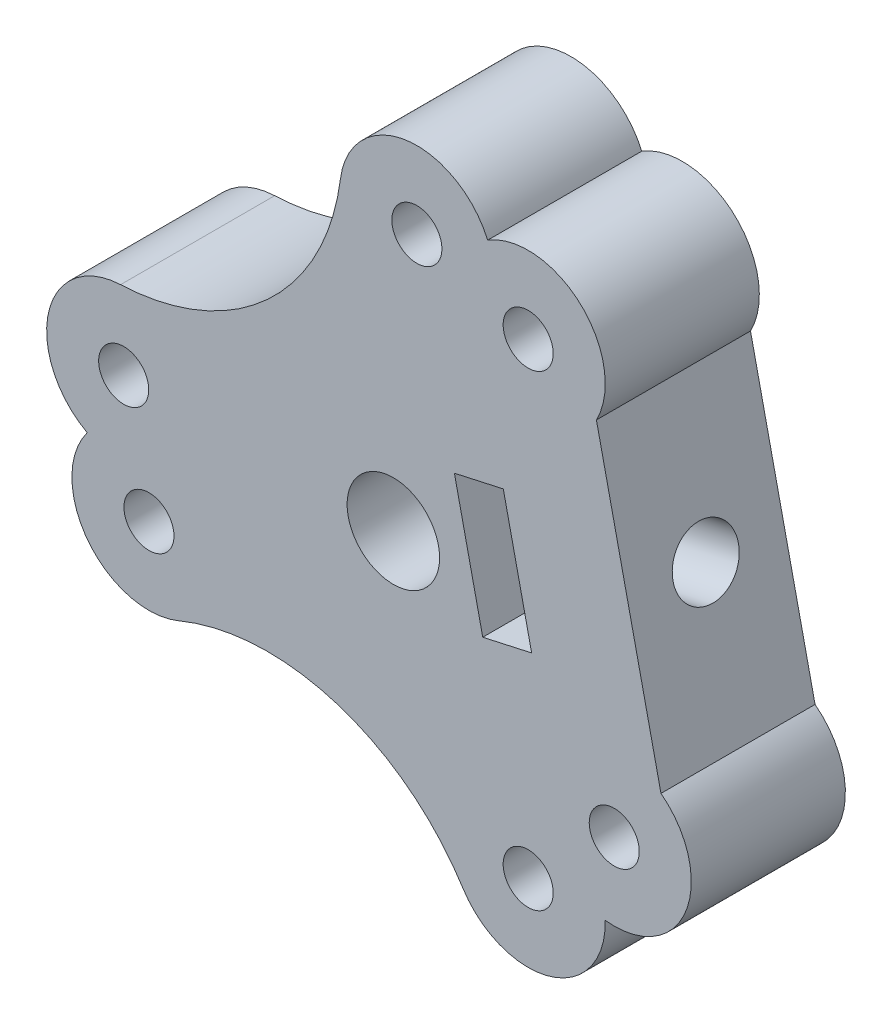
ISO-10303-21;
HEADER;
FILE_DESCRIPTION(('STEP AP214'),'2;1');
FILE_NAME('part.step','',(''),(''),'','','');
FILE_SCHEMA(('AUTOMOTIVE_DESIGN { 1 0 10303 214 1 1 1 1 }'));
ENDSEC;
DATA;
#1=APPLICATION_CONTEXT('core data for automotive mechanical design processes');
#2=APPLICATION_PROTOCOL_DEFINITION('international standard','automotive_design',2000,#1);
#3=PRODUCT_CONTEXT('',#1,'mechanical');
#4=PRODUCT('Part','Part','',(#3));
#5=PRODUCT_RELATED_PRODUCT_CATEGORY('part','',(#4));
#6=PRODUCT_DEFINITION_FORMATION('','',#4);
#7=PRODUCT_DEFINITION_CONTEXT('part definition',#1,'design');
#8=PRODUCT_DEFINITION('design','',#6,#7);
#9=PRODUCT_DEFINITION_SHAPE('','',#8);
#10=(LENGTH_UNIT() NAMED_UNIT(*) SI_UNIT(.MILLI.,.METRE.));
#11=(NAMED_UNIT(*) PLANE_ANGLE_UNIT() SI_UNIT($,.RADIAN.));
#12=(NAMED_UNIT(*) SI_UNIT($,.STERADIAN.) SOLID_ANGLE_UNIT());
#13=UNCERTAINTY_MEASURE_WITH_UNIT(LENGTH_MEASURE(1.E-05),#10,'distance_accuracy_value','');
#14=(GEOMETRIC_REPRESENTATION_CONTEXT(3) GLOBAL_UNCERTAINTY_ASSIGNED_CONTEXT((#13)) GLOBAL_UNIT_ASSIGNED_CONTEXT((#10,
#11,#12)) REPRESENTATION_CONTEXT('',''));
#15=CARTESIAN_POINT('',(0.,0.,0.));
#16=DIRECTION('',(0.,0.,1.));
#17=DIRECTION('',(1.,0.,0.));
#18=AXIS2_PLACEMENT_3D('',#15,#16,#17);
#19=CARTESIAN_POINT('',(8.88999999999986,15.3979316792874,10.16));
#20=DIRECTION('',(0.,0.,-1.));
#21=DIRECTION('',(-1.,0.,0.));
#22=AXIS2_PLACEMENT_3D('',#19,#20,#21);
#23=CYLINDRICAL_SURFACE('',#22,5.08);
#24=CARTESIAN_POINT('',(8.88999999999986,15.3979316792874,10.16));
#25=DIRECTION('',(0.,0.,1.));
#26=DIRECTION('',(-0.499999999999992,-0.866025403784443,0.));
#27=AXIS2_PLACEMENT_3D('',#24,#25,#26);
#28=CIRCLE('',#27,5.08);
#29=CARTESIAN_POINT('',(13.3888501957453,13.0385362236165,10.16));
#30=VERTEX_POINT('',#29);
#31=CARTESIAN_POINT('',(6.21700754789933,19.717828825171,10.16));
#32=VERTEX_POINT('',#31);
#33=EDGE_CURVE('E149',#30,#32,#28,.T.);
#34=ORIENTED_EDGE('',*,*,#33,.F.);
#35=DIRECTION('',(0.,0.,-1.));
#36=VECTOR('',#35,1.);
#37=CARTESIAN_POINT('',(13.3888501957454,13.0385362236164,10.16));
#38=LINE('',#37,#36);
#39=CARTESIAN_POINT('',(13.3888501957453,13.0385362236165,0.));
#40=VERTEX_POINT('',#39);
#41=EDGE_CURVE('E134',#30,#40,#38,.T.);
#42=ORIENTED_EDGE('',*,*,#41,.T.);
#43=CARTESIAN_POINT('',(8.88999999999986,15.3979316792874,0.));
#44=DIRECTION('',(0.,0.,1.));
#45=DIRECTION('',(-0.499999999999992,-0.866025403784443,0.));
#46=AXIS2_PLACEMENT_3D('',#43,#44,#45);
#47=CIRCLE('',#46,5.08);
#48=CARTESIAN_POINT('',(6.21700754789933,19.717828825171,0.));
#49=VERTEX_POINT('',#48);
#50=EDGE_CURVE('E147',#40,#49,#47,.T.);
#51=ORIENTED_EDGE('',*,*,#50,.T.);
#52=DIRECTION('',(0.,0.,-1.));
#53=VECTOR('',#52,1.);
#54=CARTESIAN_POINT('',(6.21700754789933,19.717828825171,5.08));
#55=LINE('',#54,#53);
#56=EDGE_CURVE('E228',#32,#49,#55,.T.);
#57=ORIENTED_EDGE('',*,*,#56,.F.);
#58=EDGE_LOOP('',(#34,#42,#51,#57));
#59=FACE_BOUND('',#58,.T.);
#60=ADVANCED_FACE('F37',(#59),#23,.T.);
#61=CARTESIAN_POINT('',(8.89000000000007,-15.3979316792873,10.16));
#62=DIRECTION('',(0.,0.,-1.));
#63=DIRECTION('',(-1.,0.,0.));
#64=AXIS2_PLACEMENT_3D('',#61,#62,#63);
#65=CYLINDRICAL_SURFACE('',#64,5.08);
#66=CARTESIAN_POINT('',(8.89000000000007,-15.3979316792873,10.16));
#67=DIRECTION('',(0.,0.,1.));
#68=DIRECTION('',(-0.500000000000004,0.866025403784436,0.));
#69=AXIS2_PLACEMENT_3D('',#66,#67,#68);
#70=CIRCLE('',#69,5.08);
#71=CARTESIAN_POINT('',(4.59727849994271,-18.114352508788,10.16));
#72=VERTEX_POINT('',#71);
#73=CARTESIAN_POINT('',(13.9676368961215,-15.243000884586,10.16));
#74=VERTEX_POINT('',#73);
#75=EDGE_CURVE('E172',#72,#74,#70,.T.);
#76=ORIENTED_EDGE('',*,*,#75,.F.);
#77=DIRECTION('',(0.,0.,-1.));
#78=VECTOR('',#77,1.);
#79=CARTESIAN_POINT('',(4.59727849994271,-18.114352508788,10.16));
#80=LINE('',#79,#78);
#81=CARTESIAN_POINT('',(4.59727849994271,-18.114352508788,0.));
#82=VERTEX_POINT('',#81);
#83=EDGE_CURVE('E210',#72,#82,#80,.T.);
#84=ORIENTED_EDGE('',*,*,#83,.T.);
#85=CARTESIAN_POINT('',(8.89000000000007,-15.3979316792873,0.));
#86=DIRECTION('',(0.,0.,1.));
#87=DIRECTION('',(-0.500000000000004,0.866025403784436,0.));
#88=AXIS2_PLACEMENT_3D('',#85,#86,#87);
#89=CIRCLE('',#88,5.08);
#90=CARTESIAN_POINT('',(13.9676368961215,-15.243000884586,0.));
#91=VERTEX_POINT('',#90);
#92=EDGE_CURVE('E169',#82,#91,#89,.T.);
#93=ORIENTED_EDGE('',*,*,#92,.T.);
#94=DIRECTION('',(0.,0.,-1.));
#95=VECTOR('',#94,1.);
#96=CARTESIAN_POINT('',(13.9676368961215,-15.243000884586,5.08));
#97=LINE('',#96,#95);
#98=EDGE_CURVE('E258',#74,#91,#97,.T.);
#99=ORIENTED_EDGE('',*,*,#98,.F.);
#100=EDGE_LOOP('',(#76,#84,#93,#99));
#101=FACE_BOUND('',#100,.T.);
#102=ADVANCED_FACE('F249',(#101),#65,.T.);
#103=CARTESIAN_POINT('',(-17.78,0.,10.16));
#104=DIRECTION('',(0.,0.,-1.));
#105=DIRECTION('',(-1.,0.,0.));
#106=AXIS2_PLACEMENT_3D('',#103,#104,#105);
#107=CYLINDRICAL_SURFACE('',#106,5.08);
#108=CARTESIAN_POINT('',(-17.78,0.,10.16));
#109=DIRECTION('',(0.,0.,1.));
#110=DIRECTION('',(1.,0.,0.));
#111=AXIS2_PLACEMENT_3D('',#108,#109,#110);
#112=CIRCLE('',#111,5.08);
#113=CARTESIAN_POINT('',(-17.9861286956882,5.07581628517167,10.16));
#114=VERTEX_POINT('',#113);
#115=CARTESIAN_POINT('',(-20.1846444440209,-4.47482794058491,10.16));
#116=VERTEX_POINT('',#115);
#117=EDGE_CURVE('E199',#114,#116,#112,.T.);
#118=ORIENTED_EDGE('',*,*,#117,.F.);
#119=DIRECTION('',(0.,0.,-1.));
#120=VECTOR('',#119,1.);
#121=CARTESIAN_POINT('',(-17.9861286956882,5.07581628517167,10.16));
#122=LINE('',#121,#120);
#123=CARTESIAN_POINT('',(-17.9861286956882,5.07581628517167,0.));
#124=VERTEX_POINT('',#123);
#125=EDGE_CURVE('E208',#114,#124,#122,.T.);
#126=ORIENTED_EDGE('',*,*,#125,.T.);
#127=CARTESIAN_POINT('',(-17.78,0.,0.));
#128=DIRECTION('',(0.,0.,1.));
#129=DIRECTION('',(1.,0.,0.));
#130=AXIS2_PLACEMENT_3D('',#127,#128,#129);
#131=CIRCLE('',#130,5.08);
#132=CARTESIAN_POINT('',(-20.1846444440209,-4.47482794058491,0.));
#133=VERTEX_POINT('',#132);
#134=EDGE_CURVE('E196',#124,#133,#131,.T.);
#135=ORIENTED_EDGE('',*,*,#134,.T.);
#136=DIRECTION('',(0.,0.,-1.));
#137=VECTOR('',#136,1.);
#138=CARTESIAN_POINT('',(-20.1846444440209,-4.47482794058491,5.08));
#139=LINE('',#138,#137);
#140=EDGE_CURVE('E201',#116,#133,#139,.T.);
#141=ORIENTED_EDGE('',*,*,#140,.F.);
#142=EDGE_LOOP('',(#118,#126,#135,#141));
#143=FACE_BOUND('',#142,.T.);
#144=ADVANCED_FACE('F240',(#143),#107,.T.);
#145=CARTESIAN_POINT('',(-17.78,0.,10.16));
#146=DIRECTION('',(0.,0.,1.));
#147=DIRECTION('',(1.,0.,0.));
#148=AXIS2_PLACEMENT_3D('',#145,#146,#147);
#149=PLANE('',#148);
#150=DIRECTION('',(0.21643961393811,-0.976296007119932,0.));
#151=VECTOR('',#150,1.);
#152=CARTESIAN_POINT('',(13.3888501957453,13.0385362236165,10.16));
#153=LINE('',#152,#151);
#154=CARTESIAN_POINT('',(17.6447427063392,-6.15855431459024,10.16));
#155=VERTEX_POINT('',#154);
#156=EDGE_CURVE('E141',#30,#155,#153,.T.);
#157=ORIENTED_EDGE('',*,*,#156,.F.);
#158=ORIENTED_EDGE('',*,*,#33,.T.);
#159=CARTESIAN_POINT('',(1.54962910605318,17.7123417320713,10.16));
#160=DIRECTION('',(0.,0.,1.));
#161=DIRECTION('',(-0.087155742747648,-0.996194698091746,0.));
#162=AXIS2_PLACEMENT_3D('',#159,#160,#161);
#163=CIRCLE('',#162,5.08);
#164=CARTESIAN_POINT('',(-3.48890686614827,18.3600725842251,10.16));
#165=VERTEX_POINT('',#164);
#166=EDGE_CURVE('E229',#32,#165,#163,.T.);
#167=ORIENTED_EDGE('',*,*,#166,.T.);
#168=CARTESIAN_POINT('',(-18.6045147827526,20.3032651406867,10.16));
#169=DIRECTION('',(0.,0.,1.));
#170=DIRECTION('',(1.,0.,0.));
#171=AXIS2_PLACEMENT_3D('',#168,#169,#170);
#172=CIRCLE('',#171,15.24);
#173=EDGE_CURVE('E215',#165,#114,#172,.F.);
#174=ORIENTED_EDGE('',*,*,#173,.T.);
#175=ORIENTED_EDGE('',*,*,#117,.T.);
#176=CARTESIAN_POINT('',(-16.1141524535116,-7.51415269374965,10.16));
#177=DIRECTION('',(0.,0.,1.));
#178=DIRECTION('',(0.90630778703665,0.4226182617407,0.));
#179=AXIS2_PLACEMENT_3D('',#176,#177,#178);
#180=CIRCLE('',#179,5.08);
#181=CARTESIAN_POINT('',(-14.1558358401911,-12.2015182696348,10.16));
#182=VERTEX_POINT('',#181);
#183=EDGE_CURVE('E182',#116,#182,#180,.T.);
#184=ORIENTED_EDGE('',*,*,#183,.T.);
#185=CARTESIAN_POINT('',(-8.28088600022939,-26.2636149972901,10.16));
#186=DIRECTION('',(0.,0.,1.));
#187=DIRECTION('',(1.,0.,0.));
#188=AXIS2_PLACEMENT_3D('',#185,#186,#187);
#189=CIRCLE('',#188,15.24);
#190=EDGE_CURVE('E11',#182,#72,#189,.F.);
#191=ORIENTED_EDGE('',*,*,#190,.T.);
#192=ORIENTED_EDGE('',*,*,#75,.T.);
#193=CARTESIAN_POINT('',(14.5645233474583,-10.1981890383215,10.16));
#194=DIRECTION('',(0.,0.,1.));
#195=DIRECTION('',(-0.819152044288995,0.573576436351042,0.));
#196=AXIS2_PLACEMENT_3D('',#193,#194,#195);
#197=CIRCLE('',#196,5.08);
#198=EDGE_CURVE('E254',#74,#155,#197,.T.);
#199=ORIENTED_EDGE('',*,*,#198,.T.);
#200=EDGE_LOOP('',(#157,#158,#167,#174,#175,#184,#191,#192,#199));
#201=FACE_BOUND('',#200,.T.);
#202=DIRECTION('',(-0.976296007119932,-0.216439613938109,0.));
#203=VECTOR('',#202,1.);
#204=CARTESIAN_POINT('',(7.24872687869451,6.0298430027731,10.16));
#205=LINE('',#204,#203);
#206=CARTESIAN_POINT('',(7.24872687869451,6.0298430027731,10.16));
#207=VERTEX_POINT('',#206);
#208=CARTESIAN_POINT('',(4.02499746318449,5.31515939754946,10.16));
#209=VERTEX_POINT('',#208);
#210=EDGE_CURVE('E53',#207,#209,#205,.T.);
#211=ORIENTED_EDGE('',*,*,#210,.F.);
#212=DIRECTION('',(-0.21643961393811,0.976296007119932,0.));
#213=VECTOR('',#212,1.);
#214=CARTESIAN_POINT('',(9.11789938466402,-2.40144931471462,10.16));
#215=LINE('',#214,#213);
#216=CARTESIAN_POINT('',(9.11789938466402,-2.40144931471462,10.16));
#217=VERTEX_POINT('',#216);
#218=EDGE_CURVE('E353',#217,#207,#215,.T.);
#219=ORIENTED_EDGE('',*,*,#218,.F.);
#220=DIRECTION('',(0.976296007119931,0.216439613938111,0.));
#221=VECTOR('',#220,1.);
#222=CARTESIAN_POINT('',(5.89416996915401,-3.11613291993827,10.16));
#223=LINE('',#222,#221);
#224=CARTESIAN_POINT('',(5.89416996915401,-3.11613291993827,10.16));
#225=VERTEX_POINT('',#224);
#226=EDGE_CURVE('E357',#225,#217,#223,.T.);
#227=ORIENTED_EDGE('',*,*,#226,.F.);
#228=DIRECTION('',(0.21643961393811,-0.976296007119932,0.));
#229=VECTOR('',#228,1.);
#230=CARTESIAN_POINT('',(4.02499746318449,5.31515939754946,10.16));
#231=LINE('',#230,#229);
#232=EDGE_CURVE('E360',#209,#225,#231,.T.);
#233=ORIENTED_EDGE('',*,*,#232,.F.);
#234=EDGE_LOOP('',(#211,#219,#227,#233));
#235=FACE_BOUND('',#234,.T.);
#236=CARTESIAN_POINT('',(0.,0.,10.16));
#237=DIRECTION('',(0.,0.,1.));
#238=DIRECTION('',(1.,0.,0.));
#239=AXIS2_PLACEMENT_3D('',#236,#237,#238);
#240=CIRCLE('',#239,3.048);
#241=CARTESIAN_POINT('',(3.048,0.,10.16));
#242=VERTEX_POINT('',#241);
#243=EDGE_CURVE('E193',#242,#242,#240,.T.);
#244=ORIENTED_EDGE('',*,*,#243,.F.);
#245=EDGE_LOOP('',(#244));
#246=FACE_BOUND('',#245,.T.);
#247=CARTESIAN_POINT('',(8.88999999999986,15.3979316792874,10.16));
#248=DIRECTION('',(0.,0.,1.));
#249=DIRECTION('',(-0.499999999999992,-0.866025403784443,0.));
#250=AXIS2_PLACEMENT_3D('',#247,#248,#249);
#251=CIRCLE('',#250,1.651);
#252=CARTESIAN_POINT('',(8.06449999999987,13.9681237376393,10.16));
#253=VERTEX_POINT('',#252);
#254=EDGE_CURVE('E157',#253,#253,#251,.T.);
#255=ORIENTED_EDGE('',*,*,#254,.F.);
#256=EDGE_LOOP('',(#255));
#257=FACE_BOUND('',#256,.T.);
#258=CARTESIAN_POINT('',(1.54962910605318,17.7123417320713,10.16));
#259=DIRECTION('',(0.,0.,1.));
#260=DIRECTION('',(-0.087155742747648,-0.996194698091746,0.));
#261=AXIS2_PLACEMENT_3D('',#258,#259,#260);
#262=CIRCLE('',#261,1.651);
#263=CARTESIAN_POINT('',(1.40573497477681,16.0676242855218,10.16));
#264=VERTEX_POINT('',#263);
#265=EDGE_CURVE('E230',#264,#264,#262,.T.);
#266=ORIENTED_EDGE('',*,*,#265,.F.);
#267=EDGE_LOOP('',(#266));
#268=FACE_BOUND('',#267,.T.);
#269=CARTESIAN_POINT('',(-17.78,0.,10.16));
#270=DIRECTION('',(0.,0.,1.));
#271=DIRECTION('',(1.,0.,0.));
#272=AXIS2_PLACEMENT_3D('',#269,#270,#271);
#273=CIRCLE('',#272,1.651);
#274=CARTESIAN_POINT('',(-16.129,0.,10.16));
#275=VERTEX_POINT('',#274);
#276=EDGE_CURVE('E187',#275,#275,#273,.T.);
#277=ORIENTED_EDGE('',*,*,#276,.F.);
#278=EDGE_LOOP('',(#277));
#279=FACE_BOUND('',#278,.T.);
#280=CARTESIAN_POINT('',(-16.1141524535116,-7.51415269374965,10.16));
#281=DIRECTION('',(0.,0.,1.));
#282=DIRECTION('',(0.90630778703665,0.4226182617407,0.));
#283=AXIS2_PLACEMENT_3D('',#280,#281,#282);
#284=CIRCLE('',#283,1.651);
#285=CARTESIAN_POINT('',(-14.6178382971141,-6.81640994361575,10.16));
#286=VERTEX_POINT('',#285);
#287=EDGE_CURVE('E176',#286,#286,#284,.T.);
#288=ORIENTED_EDGE('',*,*,#287,.F.);
#289=EDGE_LOOP('',(#288));
#290=FACE_BOUND('',#289,.T.);
#291=CARTESIAN_POINT('',(14.5645233474583,-10.1981890383215,10.16));
#292=DIRECTION('',(0.,0.,1.));
#293=DIRECTION('',(-0.819152044288995,0.573576436351042,0.));
#294=AXIS2_PLACEMENT_3D('',#291,#292,#293);
#295=CIRCLE('',#294,1.651);
#296=CARTESIAN_POINT('',(13.2121033223372,-9.25121434190595,10.16));
#297=VERTEX_POINT('',#296);
#298=EDGE_CURVE('E255',#297,#297,#295,.T.);
#299=ORIENTED_EDGE('',*,*,#298,.F.);
#300=EDGE_LOOP('',(#299));
#301=FACE_BOUND('',#300,.T.);
#302=CARTESIAN_POINT('',(8.89000000000007,-15.3979316792873,10.16));
#303=DIRECTION('',(0.,0.,1.));
#304=DIRECTION('',(-0.500000000000004,0.866025403784436,0.));
#305=AXIS2_PLACEMENT_3D('',#302,#303,#304);
#306=CIRCLE('',#305,1.651);
#307=CARTESIAN_POINT('',(8.06450000000006,-13.9681237376392,10.16));
#308=VERTEX_POINT('',#307);
#309=EDGE_CURVE('E166',#308,#308,#306,.T.);
#310=ORIENTED_EDGE('',*,*,#309,.F.);
#311=EDGE_LOOP('',(#310));
#312=FACE_BOUND('',#311,.T.);
#313=ADVANCED_FACE('F235',(#201,#235,#246,#257,#268,#279,#290,#301,#312),#149,.T.);
#314=CARTESIAN_POINT('',(-17.78,0.,0.));
#315=DIRECTION('',(0.,0.,1.));
#316=DIRECTION('',(1.,0.,0.));
#317=AXIS2_PLACEMENT_3D('',#314,#315,#316);
#318=PLANE('',#317);
#319=ORIENTED_EDGE('',*,*,#50,.F.);
#320=DIRECTION('',(-0.21643961393811,0.976296007119932,0.));
#321=VECTOR('',#320,1.);
#322=CARTESIAN_POINT('',(13.3888501957453,13.0385362236165,0.));
#323=LINE('',#322,#321);
#324=CARTESIAN_POINT('',(17.6447427063392,-6.15855431459024,0.));
#325=VERTEX_POINT('',#324);
#326=EDGE_CURVE('E131',#325,#40,#323,.T.);
#327=ORIENTED_EDGE('',*,*,#326,.F.);
#328=CARTESIAN_POINT('',(14.5645233474583,-10.1981890383215,0.));
#329=DIRECTION('',(0.,0.,1.));
#330=DIRECTION('',(-0.819152044288995,0.573576436351042,0.));
#331=AXIS2_PLACEMENT_3D('',#328,#329,#330);
#332=CIRCLE('',#331,5.08);
#333=EDGE_CURVE('E252',#91,#325,#332,.T.);
#334=ORIENTED_EDGE('',*,*,#333,.F.);
#335=ORIENTED_EDGE('',*,*,#92,.F.);
#336=CARTESIAN_POINT('',(-8.28088600022939,-26.2636149972901,0.));
#337=DIRECTION('',(0.,0.,1.));
#338=DIRECTION('',(1.,0.,0.));
#339=AXIS2_PLACEMENT_3D('',#336,#337,#338);
#340=CIRCLE('',#339,15.24);
#341=CARTESIAN_POINT('',(-14.1558358401911,-12.2015182696348,0.));
#342=VERTEX_POINT('',#341);
#343=EDGE_CURVE('E46',#82,#342,#340,.T.);
#344=ORIENTED_EDGE('',*,*,#343,.T.);
#345=CARTESIAN_POINT('',(-16.1141524535116,-7.51415269374965,0.));
#346=DIRECTION('',(0.,0.,1.));
#347=DIRECTION('',(0.90630778703665,0.4226182617407,0.));
#348=AXIS2_PLACEMENT_3D('',#345,#346,#347);
#349=CIRCLE('',#348,5.08);
#350=EDGE_CURVE('E179',#133,#342,#349,.T.);
#351=ORIENTED_EDGE('',*,*,#350,.F.);
#352=ORIENTED_EDGE('',*,*,#134,.F.);
#353=CARTESIAN_POINT('',(-18.6045147827526,20.3032651406867,0.));
#354=DIRECTION('',(0.,0.,1.));
#355=DIRECTION('',(1.,0.,0.));
#356=AXIS2_PLACEMENT_3D('',#353,#354,#355);
#357=CIRCLE('',#356,15.24);
#358=CARTESIAN_POINT('',(-3.48890686614827,18.3600725842251,0.));
#359=VERTEX_POINT('',#358);
#360=EDGE_CURVE('E217',#124,#359,#357,.T.);
#361=ORIENTED_EDGE('',*,*,#360,.T.);
#362=CARTESIAN_POINT('',(1.54962910605318,17.7123417320713,0.));
#363=DIRECTION('',(0.,0.,1.));
#364=DIRECTION('',(-0.087155742747648,-0.996194698091746,0.));
#365=AXIS2_PLACEMENT_3D('',#362,#363,#364);
#366=CIRCLE('',#365,5.08);
#367=EDGE_CURVE('E156',#49,#359,#366,.T.);
#368=ORIENTED_EDGE('',*,*,#367,.F.);
#369=EDGE_LOOP('',(#319,#327,#334,#335,#344,#351,#352,#361,#368));
#370=FACE_BOUND('',#369,.T.);
#371=CARTESIAN_POINT('',(0.,0.,0.));
#372=DIRECTION('',(0.,0.,1.));
#373=DIRECTION('',(1.,0.,0.));
#374=AXIS2_PLACEMENT_3D('',#371,#372,#373);
#375=CIRCLE('',#374,3.048);
#376=CARTESIAN_POINT('',(3.048,0.,0.));
#377=VERTEX_POINT('',#376);
#378=EDGE_CURVE('E190',#377,#377,#375,.T.);
#379=ORIENTED_EDGE('',*,*,#378,.T.);
#380=EDGE_LOOP('',(#379));
#381=FACE_BOUND('',#380,.T.);
#382=CARTESIAN_POINT('',(8.88999999999986,15.3979316792874,0.));
#383=DIRECTION('',(0.,0.,1.));
#384=DIRECTION('',(-0.499999999999992,-0.866025403784443,0.));
#385=AXIS2_PLACEMENT_3D('',#382,#383,#384);
#386=CIRCLE('',#385,1.651);
#387=CARTESIAN_POINT('',(8.06449999999987,13.9681237376393,0.));
#388=VERTEX_POINT('',#387);
#389=EDGE_CURVE('E162',#388,#388,#386,.T.);
#390=ORIENTED_EDGE('',*,*,#389,.T.);
#391=EDGE_LOOP('',(#390));
#392=FACE_BOUND('',#391,.T.);
#393=CARTESIAN_POINT('',(1.54962910605318,17.7123417320713,0.));
#394=DIRECTION('',(0.,0.,1.));
#395=DIRECTION('',(-0.087155742747648,-0.996194698091746,0.));
#396=AXIS2_PLACEMENT_3D('',#393,#394,#395);
#397=CIRCLE('',#396,1.651);
#398=CARTESIAN_POINT('',(1.40573497477681,16.0676242855218,0.));
#399=VERTEX_POINT('',#398);
#400=EDGE_CURVE('E340',#399,#399,#397,.T.);
#401=ORIENTED_EDGE('',*,*,#400,.T.);
#402=EDGE_LOOP('',(#401));
#403=FACE_BOUND('',#402,.T.);
#404=CARTESIAN_POINT('',(-17.78,0.,0.));
#405=DIRECTION('',(0.,0.,1.));
#406=DIRECTION('',(1.,0.,0.));
#407=AXIS2_PLACEMENT_3D('',#404,#405,#406);
#408=CIRCLE('',#407,1.651);
#409=CARTESIAN_POINT('',(-16.129,0.,0.));
#410=VERTEX_POINT('',#409);
#411=EDGE_CURVE('E185',#410,#410,#408,.T.);
#412=ORIENTED_EDGE('',*,*,#411,.T.);
#413=EDGE_LOOP('',(#412));
#414=FACE_BOUND('',#413,.T.);
#415=CARTESIAN_POINT('',(-16.1141524535116,-7.51415269374965,0.));
#416=DIRECTION('',(0.,0.,1.));
#417=DIRECTION('',(0.90630778703665,0.4226182617407,0.));
#418=AXIS2_PLACEMENT_3D('',#415,#416,#417);
#419=CIRCLE('',#418,1.651);
#420=CARTESIAN_POINT('',(-14.6178382971141,-6.81640994361575,0.));
#421=VERTEX_POINT('',#420);
#422=EDGE_CURVE('E174',#421,#421,#419,.T.);
#423=ORIENTED_EDGE('',*,*,#422,.T.);
#424=EDGE_LOOP('',(#423));
#425=FACE_BOUND('',#424,.T.);
#426=CARTESIAN_POINT('',(14.5645233474583,-10.1981890383215,0.));
#427=DIRECTION('',(0.,0.,1.));
#428=DIRECTION('',(-0.819152044288995,0.573576436351042,0.));
#429=AXIS2_PLACEMENT_3D('',#426,#427,#428);
#430=CIRCLE('',#429,1.651);
#431=CARTESIAN_POINT('',(13.2121033223372,-9.25121434190595,0.));
#432=VERTEX_POINT('',#431);
#433=EDGE_CURVE('E261',#432,#432,#430,.T.);
#434=ORIENTED_EDGE('',*,*,#433,.T.);
#435=EDGE_LOOP('',(#434));
#436=FACE_BOUND('',#435,.T.);
#437=CARTESIAN_POINT('',(8.89000000000007,-15.3979316792873,0.));
#438=DIRECTION('',(0.,0.,1.));
#439=DIRECTION('',(-0.500000000000004,0.866025403784436,0.));
#440=AXIS2_PLACEMENT_3D('',#437,#438,#439);
#441=CIRCLE('',#440,1.651);
#442=CARTESIAN_POINT('',(8.06450000000006,-13.9681237376392,0.));
#443=VERTEX_POINT('',#442);
#444=EDGE_CURVE('E159',#443,#443,#441,.T.);
#445=ORIENTED_EDGE('',*,*,#444,.T.);
#446=EDGE_LOOP('',(#445));
#447=FACE_BOUND('',#446,.T.);
#448=ADVANCED_FACE('F153',(#370,#381,#392,#403,#414,#425,#436,#447),#318,.F.);
#449=CARTESIAN_POINT('',(0.,0.,10.16));
#450=DIRECTION('',(0.,0.,-1.));
#451=DIRECTION('',(-1.,0.,0.));
#452=AXIS2_PLACEMENT_3D('',#449,#450,#451);
#453=CYLINDRICAL_SURFACE('',#452,3.048);
#454=CARTESIAN_POINT('',(1.63322378504056,2.57349646745003,5.08));
#455=CARTESIAN_POINT('',(1.63322606319953,2.57349611214073,5.18318562750395));
#456=CARTESIAN_POINT('',(1.64223049463613,2.56784571983823,5.28637518265942));
#457=CARTESIAN_POINT('',(1.67648099396854,2.54560418256706,5.48889738553348));
#458=CARTESIAN_POINT('',(1.70176511529816,2.52898740161498,5.58822041699108));
#459=CARTESIAN_POINT('',(1.76423975745952,2.48579343559902,5.77927684534231));
#460=CARTESIAN_POINT('',(1.80129111953189,2.45933207451809,5.87108391570665));
#461=CARTESIAN_POINT('',(1.88346554296545,2.39698178871022,6.04748681635046));
#462=CARTESIAN_POINT('',(1.92858869988813,2.36109275236728,6.132082561238));
#463=CARTESIAN_POINT('',(2.03229139570823,2.27277921796493,6.30836503937765));
#464=CARTESIAN_POINT('',(2.09183002447037,2.21853976950929,6.39857833591642));
#465=CARTESIAN_POINT('',(2.21355534782735,2.09711462378684,6.56799972700831));
#466=CARTESIAN_POINT('',(2.27574536352989,2.0299122946534,6.64719345588984));
#467=CARTESIAN_POINT('',(2.40984682509051,1.86966653440731,6.80593188314572));
#468=CARTESIAN_POINT('',(2.48158607848317,1.77416552115855,6.88318383988954));
#469=CARTESIAN_POINT('',(2.61810346338441,1.5656522783627,7.01753942504845));
#470=CARTESIAN_POINT('',(2.68289573520488,1.45267680885906,7.07468454310719));
#471=CARTESIAN_POINT('',(2.78392414800145,1.24480781140252,7.15264273344529));
#472=CARTESIAN_POINT('',(2.82311735841992,1.1534602275267,7.17912268132713));
#473=CARTESIAN_POINT('',(2.89303217504015,0.964758495987406,7.21819761546761));
#474=CARTESIAN_POINT('',(2.92376062499353,0.867409279039426,7.23080384346424));
#475=CARTESIAN_POINT('',(2.97540970780857,0.669147076621716,7.24141743644717));
#476=CARTESIAN_POINT('',(2.99631018728772,0.568227220596349,7.23939494139769));
#477=CARTESIAN_POINT('',(3.02766253546736,0.366100687242969,7.22080710376612));
#478=CARTESIAN_POINT('',(3.03811156154654,0.264893939387017,7.20423780699584));
#479=CARTESIAN_POINT('',(3.04881209079029,0.0676445505856488,7.15808142997949));
#480=CARTESIAN_POINT('',(3.04930863305319,-0.0284638904442158,7.12882533343882));
#481=CARTESIAN_POINT('',(3.04178974732779,-0.215946676390526,7.05870021748455));
#482=CARTESIAN_POINT('',(3.03377261353625,-0.3073200687431,7.01782887203734));
#483=CARTESIAN_POINT('',(3.00938663736291,-0.493642602345551,6.92070577741505));
#484=CARTESIAN_POINT('',(2.99218393648498,-0.58784852605247,6.86324503112359));
#485=CARTESIAN_POINT('',(2.9513355059513,-0.767065740888291,6.73727017763791));
#486=CARTESIAN_POINT('',(2.92768305104304,-0.852067304519416,6.66874456353448));
#487=CARTESIAN_POINT('',(2.87174180923032,-1.0262605906552,6.50843605870188));
#488=CARTESIAN_POINT('',(2.83866467212211,-1.11339753218829,6.41469029968535));
#489=CARTESIAN_POINT('',(2.77157432773127,-1.27122704380097,6.21445656685597));
#490=CARTESIAN_POINT('',(2.73756125246093,-1.34192191984155,6.107970383034));
#491=CARTESIAN_POINT('',(2.68158855863173,-1.44989963884567,5.90867769054653));
#492=CARTESIAN_POINT('',(2.65864958437442,-1.49112565646429,5.81829481449915));
#493=CARTESIAN_POINT('',(2.61890665471621,-1.55987681987405,5.63122607551478));
#494=CARTESIAN_POINT('',(2.6020912796286,-1.58742750352973,5.53455234532442));
#495=CARTESIAN_POINT('',(2.57763794928464,-1.62685653235234,5.33566897374205));
#496=CARTESIAN_POINT('',(2.57010266073729,-1.63855969303746,5.23341024907239));
#497=CARTESIAN_POINT('',(2.56642984391367,-1.64431249719634,5.02820755304788));
#498=CARTESIAN_POINT('',(2.5702859649807,-1.63837197692838,4.9252639954128));
#499=CARTESIAN_POINT('',(2.58700589114398,-1.61179346022821,4.73806141342203));
#500=CARTESIAN_POINT('',(2.59843191068061,-1.59349353653383,4.65331578340054));
#501=CARTESIAN_POINT('',(2.62694222037664,-1.54604165035289,4.48789950284102));
#502=CARTESIAN_POINT('',(2.64403285686198,-1.51687751163392,4.40723354030068));
#503=CARTESIAN_POINT('',(2.69076758493929,-1.43294357471763,4.21359974775067));
#504=CARTESIAN_POINT('',(2.72251235885499,-1.37259479843254,4.1035622862387));
#505=CARTESIAN_POINT('',(2.78771581984871,-1.23481799688431,3.89525791753588));
#506=CARTESIAN_POINT('',(2.82117780294191,-1.15735610578515,3.79701495442656));
#507=CARTESIAN_POINT('',(2.88566192301309,-0.985819188228027,3.61117175074714));
#508=CARTESIAN_POINT('',(2.916617908074,-0.891428896564255,3.52383894088647));
#509=CARTESIAN_POINT('',(2.97093059528661,-0.689073775435975,3.36389344376196));
#510=CARTESIAN_POINT('',(2.99429808489008,-0.581128520680106,3.29125991656129));
#511=CARTESIAN_POINT('',(3.0268716569727,-0.371259031931794,3.17292297949554));
#512=CARTESIAN_POINT('',(3.03770258234565,-0.270960448252213,3.12479611049442));
#513=CARTESIAN_POINT('',(3.04907970516982,-0.0641476135345719,3.04265299402543));
#514=CARTESIAN_POINT('',(3.0496319378561,0.0423629532175555,3.00862847769954));
#515=CARTESIAN_POINT('',(3.03889565223828,0.259378733008082,2.95635460818801));
#516=CARTESIAN_POINT('',(3.02753509806669,0.369904301580506,2.93820245812581));
#517=CARTESIAN_POINT('',(2.99234259233569,0.590454284784807,2.91928124317922));
#518=CARTESIAN_POINT('',(2.9685164854544,0.700478909926613,2.91850403922903));
#519=CARTESIAN_POINT('',(2.9123136700589,0.904880484788416,2.93353305419355));
#520=CARTESIAN_POINT('',(2.88106952299219,0.999702373938597,2.94764055075703));
#521=CARTESIAN_POINT('',(2.81065280036888,1.18330312204825,2.98905482935036));
#522=CARTESIAN_POINT('',(2.77147880586525,1.27208089568421,3.01636397486588));
#523=CARTESIAN_POINT('',(2.68586128067317,1.44428854307704,3.08384647679766));
#524=CARTESIAN_POINT('',(2.63924309481537,1.52749535072789,3.12436269409587));
#525=CARTESIAN_POINT('',(2.54176722663095,1.68472320571859,3.21646111213431));
#526=CARTESIAN_POINT('',(2.49090876031205,1.75874254804893,3.26804536204743));
#527=CARTESIAN_POINT('',(2.37903297383255,1.90800832251515,3.38970427258635));
#528=CARTESIAN_POINT('',(2.3176640347407,1.98166227175367,3.46140613538588));
#529=CARTESIAN_POINT('',(2.19536672297628,2.11635791683528,3.61637851556431));
#530=CARTESIAN_POINT('',(2.1344394656995,2.17737430479771,3.69967169876267));
#531=CARTESIAN_POINT('',(2.00693729044884,2.29592245814053,3.89161322731128));
#532=CARTESIAN_POINT('',(1.94110765899717,2.35118808228163,4.00217468476448));
#533=CARTESIAN_POINT('',(1.82252840433552,2.44425345633848,4.23685764963098));
#534=CARTESIAN_POINT('',(1.76974837404887,2.4820939897791,4.3609466444067));
#535=CARTESIAN_POINT('',(1.69833456591702,2.53126724174678,4.58469276168117));
#536=CARTESIAN_POINT('',(1.67429394964355,2.54703699846409,4.6816134903825));
#537=CARTESIAN_POINT('',(1.64175693798165,2.56813869706289,4.87902797659887));
#538=CARTESIAN_POINT('',(1.63322156644329,2.5734968134699,4.97951212581844));
#539=CARTESIAN_POINT('',(1.63322378504056,2.57349646745003,5.08));
#540=B_SPLINE_CURVE_WITH_KNOTS('',3,(#454,#455,#456,#457,#458,#459,#460,#461,#462,#463,#464,
#465,#466,#467,#468,#469,#470,#471,#472,#473,#474,#475,#476,#477,#478,#479,#480,#481,#482,#483,
#484,#485,#486,#487,#488,#489,#490,#491,#492,#493,#494,#495,#496,#497,#498,#499,#500,#501,#502,
#503,#504,#505,#506,#507,#508,#509,#510,#511,#512,#513,#514,#515,#516,#517,#518,#519,#520,#521,
#522,#523,#524,#525,#526,#527,#528,#529,#530,#531,#532,#533,#534,#535,#536,#537,#538,#539),
.UNSPECIFIED.,.T.,.F.,(4,2,2,2,2,2,2,2,2,2,2,2,2,2,2,2,2,2,2,2,2,2,2,2,2,2,2,2,2,2,2,2,2,2,2,2,
2,2,2,2,2,2,4),(0.,0.309078920473253,0.618882942240639,0.925151726636596,1.23142413716948,
1.59294225463772,1.95492733644705,2.37931155220361,2.80281486078103,3.11009825321468,
3.41713247321448,3.72479358567909,4.03253835410834,4.3326966030482,4.63291500315273,
4.96671363796049,5.3008616692408,5.6958470979783,6.09077709748949,6.39558360845217,
6.6998187497496,7.00739029363061,7.31479040020342,7.57608441533644,7.8376721650759,
8.22394649185621,8.61099219119927,9.00618178977535,9.40080712070531,9.73476377952539,
10.0685243462339,10.4043148444976,10.7399480428056,11.0410340094181,11.342173899299,
11.6518540185859,11.961591522645,12.3194005775194,12.6779193938289,13.0960477991457,
13.5131925352772,13.8149502876191,14.115948444281),.UNSPECIFIED.);
#541=CARTESIAN_POINT('',(1.63322378504056,2.57349646745003,5.08));
#542=VERTEX_POINT('',#541);
#543=EDGE_CURVE('E380',#542,#542,#540,.T.);
#544=ORIENTED_EDGE('',*,*,#543,.T.);
#545=EDGE_LOOP('',(#544));
#546=FACE_BOUND('',#545,.T.);
#547=ORIENTED_EDGE('',*,*,#243,.T.);
#548=EDGE_LOOP('',(#547));
#549=FACE_BOUND('',#548,.T.);
#550=ORIENTED_EDGE('',*,*,#378,.F.);
#551=EDGE_LOOP('',(#550));
#552=FACE_BOUND('',#551,.T.);
#553=ADVANCED_FACE('F300',(#546,#549,#552),#453,.F.);
#554=CARTESIAN_POINT('',(-17.78,0.,10.16));
#555=DIRECTION('',(0.,0.,-1.));
#556=DIRECTION('',(-1.,0.,0.));
#557=AXIS2_PLACEMENT_3D('',#554,#555,#556);
#558=CYLINDRICAL_SURFACE('',#557,1.651);
#559=ORIENTED_EDGE('',*,*,#276,.T.);
#560=EDGE_LOOP('',(#559));
#561=FACE_BOUND('',#560,.T.);
#562=ORIENTED_EDGE('',*,*,#411,.F.);
#563=EDGE_LOOP('',(#562));
#564=FACE_BOUND('',#563,.T.);
#565=ADVANCED_FACE('F297',(#561,#564),#558,.F.);
#566=CARTESIAN_POINT('',(-16.1141524535116,-7.51415269374965,10.16));
#567=DIRECTION('',(0.,0.,-1.));
#568=DIRECTION('',(-1.,0.,0.));
#569=AXIS2_PLACEMENT_3D('',#566,#567,#568);
#570=CYLINDRICAL_SURFACE('',#569,5.08);
#571=ORIENTED_EDGE('',*,*,#350,.T.);
#572=DIRECTION('',(0.,0.,-1.));
#573=VECTOR('',#572,1.);
#574=CARTESIAN_POINT('',(-14.1558358401911,-12.2015182696348,10.16));
#575=LINE('',#574,#573);
#576=EDGE_CURVE('E213',#342,#182,#575,.F.);
#577=ORIENTED_EDGE('',*,*,#576,.T.);
#578=ORIENTED_EDGE('',*,*,#183,.F.);
#579=ORIENTED_EDGE('',*,*,#140,.T.);
#580=EDGE_LOOP('',(#571,#577,#578,#579));
#581=FACE_BOUND('',#580,.T.);
#582=ADVANCED_FACE('F242',(#581),#570,.T.);
#583=CARTESIAN_POINT('',(-16.1141524535116,-7.51415269374965,10.16));
#584=DIRECTION('',(0.,0.,-1.));
#585=DIRECTION('',(-1.,0.,0.));
#586=AXIS2_PLACEMENT_3D('',#583,#584,#585);
#587=CYLINDRICAL_SURFACE('',#586,1.651);
#588=ORIENTED_EDGE('',*,*,#287,.T.);
#589=EDGE_LOOP('',(#588));
#590=FACE_BOUND('',#589,.T.);
#591=ORIENTED_EDGE('',*,*,#422,.F.);
#592=EDGE_LOOP('',(#591));
#593=FACE_BOUND('',#592,.T.);
#594=ADVANCED_FACE('F282',(#590,#593),#587,.F.);
#595=CARTESIAN_POINT('',(8.89000000000007,-15.3979316792873,10.16));
#596=DIRECTION('',(0.,0.,-1.));
#597=DIRECTION('',(-1.,0.,0.));
#598=AXIS2_PLACEMENT_3D('',#595,#596,#597);
#599=CYLINDRICAL_SURFACE('',#598,1.651);
#600=ORIENTED_EDGE('',*,*,#309,.T.);
#601=EDGE_LOOP('',(#600));
#602=FACE_BOUND('',#601,.T.);
#603=ORIENTED_EDGE('',*,*,#444,.F.);
#604=EDGE_LOOP('',(#603));
#605=FACE_BOUND('',#604,.T.);
#606=ADVANCED_FACE('F273',(#602,#605),#599,.F.);
#607=CARTESIAN_POINT('',(8.88999999999986,15.3979316792874,10.16));
#608=DIRECTION('',(0.,0.,-1.));
#609=DIRECTION('',(-1.,0.,0.));
#610=AXIS2_PLACEMENT_3D('',#607,#608,#609);
#611=CYLINDRICAL_SURFACE('',#610,1.651);
#612=ORIENTED_EDGE('',*,*,#254,.T.);
#613=EDGE_LOOP('',(#612));
#614=FACE_BOUND('',#613,.T.);
#615=ORIENTED_EDGE('',*,*,#389,.F.);
#616=EDGE_LOOP('',(#615));
#617=FACE_BOUND('',#616,.T.);
#618=ADVANCED_FACE('F270',(#614,#617),#611,.F.);
#619=CARTESIAN_POINT('',(14.5645233474583,-10.1981890383215,10.16));
#620=DIRECTION('',(0.,0.,-1.));
#621=DIRECTION('',(-1.,0.,0.));
#622=AXIS2_PLACEMENT_3D('',#619,#620,#621);
#623=CYLINDRICAL_SURFACE('',#622,5.08);
#624=ORIENTED_EDGE('',*,*,#333,.T.);
#625=DIRECTION('',(0.,0.,-1.));
#626=VECTOR('',#625,1.);
#627=CARTESIAN_POINT('',(17.6447427063392,-6.15855431459024,10.16));
#628=LINE('',#627,#626);
#629=EDGE_CURVE('E137',#325,#155,#628,.F.);
#630=ORIENTED_EDGE('',*,*,#629,.T.);
#631=ORIENTED_EDGE('',*,*,#198,.F.);
#632=ORIENTED_EDGE('',*,*,#98,.T.);
#633=EDGE_LOOP('',(#624,#630,#631,#632));
#634=FACE_BOUND('',#633,.T.);
#635=ADVANCED_FACE('F272',(#634),#623,.T.);
#636=CARTESIAN_POINT('',(14.5645233474583,-10.1981890383215,10.16));
#637=DIRECTION('',(0.,0.,-1.));
#638=DIRECTION('',(-1.,0.,0.));
#639=AXIS2_PLACEMENT_3D('',#636,#637,#638);
#640=CYLINDRICAL_SURFACE('',#639,1.651);
#641=ORIENTED_EDGE('',*,*,#298,.T.);
#642=EDGE_LOOP('',(#641));
#643=FACE_BOUND('',#642,.T.);
#644=ORIENTED_EDGE('',*,*,#433,.F.);
#645=EDGE_LOOP('',(#644));
#646=FACE_BOUND('',#645,.T.);
#647=ADVANCED_FACE('F280',(#643,#646),#640,.F.);
#648=CARTESIAN_POINT('',(1.54962910605318,17.7123417320713,10.16));
#649=DIRECTION('',(0.,0.,-1.));
#650=DIRECTION('',(-1.,0.,0.));
#651=AXIS2_PLACEMENT_3D('',#648,#649,#650);
#652=CYLINDRICAL_SURFACE('',#651,5.08);
#653=ORIENTED_EDGE('',*,*,#367,.T.);
#654=DIRECTION('',(0.,0.,-1.));
#655=VECTOR('',#654,1.);
#656=CARTESIAN_POINT('',(-3.48890686614827,18.3600725842251,10.16));
#657=LINE('',#656,#655);
#658=EDGE_CURVE('E150',#359,#165,#657,.F.);
#659=ORIENTED_EDGE('',*,*,#658,.T.);
#660=ORIENTED_EDGE('',*,*,#166,.F.);
#661=ORIENTED_EDGE('',*,*,#56,.T.);
#662=EDGE_LOOP('',(#653,#659,#660,#661));
#663=FACE_BOUND('',#662,.T.);
#664=ADVANCED_FACE('F225',(#663),#652,.T.);
#665=CARTESIAN_POINT('',(1.54962910605318,17.7123417320713,10.16));
#666=DIRECTION('',(0.,0.,-1.));
#667=DIRECTION('',(-1.,0.,0.));
#668=AXIS2_PLACEMENT_3D('',#665,#666,#667);
#669=CYLINDRICAL_SURFACE('',#668,1.651);
#670=ORIENTED_EDGE('',*,*,#265,.T.);
#671=EDGE_LOOP('',(#670));
#672=FACE_BOUND('',#671,.T.);
#673=ORIENTED_EDGE('',*,*,#400,.F.);
#674=EDGE_LOOP('',(#673));
#675=FACE_BOUND('',#674,.T.);
#676=ADVANCED_FACE('F311',(#672,#675),#669,.F.);
#677=CARTESIAN_POINT('',(-18.6045147827526,20.3032651406867,10.16));
#678=DIRECTION('',(0.,0.,-1.));
#679=DIRECTION('',(-1.,0.,0.));
#680=AXIS2_PLACEMENT_3D('',#677,#678,#679);
#681=CYLINDRICAL_SURFACE('',#680,15.24);
#682=ORIENTED_EDGE('',*,*,#360,.F.);
#683=ORIENTED_EDGE('',*,*,#125,.F.);
#684=ORIENTED_EDGE('',*,*,#173,.F.);
#685=ORIENTED_EDGE('',*,*,#658,.F.);
#686=EDGE_LOOP('',(#682,#683,#684,#685));
#687=FACE_BOUND('',#686,.T.);
#688=ADVANCED_FACE('F232',(#687),#681,.F.);
#689=CARTESIAN_POINT('',(-8.28088600022939,-26.2636149972901,10.16));
#690=DIRECTION('',(0.,0.,1.));
#691=DIRECTION('',(1.,0.,0.));
#692=AXIS2_PLACEMENT_3D('',#689,#690,#691);
#693=CYLINDRICAL_SURFACE('',#692,15.24);
#694=ORIENTED_EDGE('',*,*,#190,.F.);
#695=ORIENTED_EDGE('',*,*,#576,.F.);
#696=ORIENTED_EDGE('',*,*,#343,.F.);
#697=ORIENTED_EDGE('',*,*,#83,.F.);
#698=EDGE_LOOP('',(#694,#695,#696,#697));
#699=FACE_BOUND('',#698,.T.);
#700=ADVANCED_FACE('F39',(#699),#693,.F.);
#701=CARTESIAN_POINT('',(7.24872687869451,6.0298430027731,0.762000000000001));
#702=DIRECTION('',(-0.216439613938109,0.976296007119932,0.));
#703=DIRECTION('',(-0.976296007119932,-0.216439613938109,0.));
#704=AXIS2_PLACEMENT_3D('',#701,#702,#703);
#705=PLANE('',#704);
#706=ORIENTED_EDGE('',*,*,#210,.T.);
#707=DIRECTION('',(0.,0.,1.));
#708=VECTOR('',#707,1.);
#709=CARTESIAN_POINT('',(4.02499746318449,5.31515939754946,0.762000000000001));
#710=LINE('',#709,#708);
#711=CARTESIAN_POINT('',(4.02499746318449,5.31515939754946,0.762000000000001));
#712=VERTEX_POINT('',#711);
#713=EDGE_CURVE('E345',#712,#209,#710,.T.);
#714=ORIENTED_EDGE('',*,*,#713,.F.);
#715=DIRECTION('',(-0.976296007119932,-0.216439613938109,0.));
#716=VECTOR('',#715,1.);
#717=CARTESIAN_POINT('',(7.24872687869451,6.0298430027731,0.762000000000001));
#718=LINE('',#717,#716);
#719=CARTESIAN_POINT('',(7.24872687869451,6.0298430027731,0.762000000000001));
#720=VERTEX_POINT('',#719);
#721=EDGE_CURVE('E356',#720,#712,#718,.T.);
#722=ORIENTED_EDGE('',*,*,#721,.F.);
#723=DIRECTION('',(0.,0.,1.));
#724=VECTOR('',#723,1.);
#725=CARTESIAN_POINT('',(7.24872687869451,6.0298430027731,0.762000000000001));
#726=LINE('',#725,#724);
#727=EDGE_CURVE('E343',#720,#207,#726,.T.);
#728=ORIENTED_EDGE('',*,*,#727,.T.);
#729=EDGE_LOOP('',(#706,#714,#722,#728));
#730=FACE_BOUND('',#729,.T.);
#731=ADVANCED_FACE('F316',(#730),#705,.F.);
#732=CARTESIAN_POINT('',(9.11789938466402,-2.40144931471462,0.762000000000001));
#733=DIRECTION('',(0.976296007119932,0.21643961393811,0.));
#734=DIRECTION('',(-0.21643961393811,0.976296007119932,0.));
#735=AXIS2_PLACEMENT_3D('',#732,#733,#734);
#736=PLANE('',#735);
#737=CARTESIAN_POINT('',(8.18331313167927,1.81419684402924,5.08));
#738=DIRECTION('',(0.976296007119932,0.21643961393811,0.));
#739=DIRECTION('',(-0.21643961393811,0.976296007119932,0.));
#740=AXIS2_PLACEMENT_3D('',#737,#738,#739);
#741=CIRCLE('',#740,2.159);
#742=CARTESIAN_POINT('',(7.71602000518689,3.92201992340117,5.08));
#743=VERTEX_POINT('',#742);
#744=EDGE_CURVE('E142',#743,#743,#741,.T.);
#745=ORIENTED_EDGE('',*,*,#744,.T.);
#746=EDGE_LOOP('',(#745));
#747=FACE_BOUND('',#746,.T.);
#748=ORIENTED_EDGE('',*,*,#218,.T.);
#749=ORIENTED_EDGE('',*,*,#727,.F.);
#750=DIRECTION('',(-0.21643961393811,0.976296007119932,0.));
#751=VECTOR('',#750,1.);
#752=CARTESIAN_POINT('',(9.11789938466402,-2.40144931471462,0.762000000000001));
#753=LINE('',#752,#751);
#754=CARTESIAN_POINT('',(9.11789938466402,-2.40144931471462,0.762000000000001));
#755=VERTEX_POINT('',#754);
#756=EDGE_CURVE('E348',#755,#720,#753,.T.);
#757=ORIENTED_EDGE('',*,*,#756,.F.);
#758=DIRECTION('',(0.,0.,1.));
#759=VECTOR('',#758,1.);
#760=CARTESIAN_POINT('',(9.11789938466402,-2.40144931471462,0.762000000000001));
#761=LINE('',#760,#759);
#762=EDGE_CURVE('E350',#755,#217,#761,.T.);
#763=ORIENTED_EDGE('',*,*,#762,.T.);
#764=EDGE_LOOP('',(#748,#749,#757,#763));
#765=FACE_BOUND('',#764,.T.);
#766=ADVANCED_FACE('F402',(#747,#765),#736,.F.);
#767=CARTESIAN_POINT('',(5.89416996915401,-3.11613291993827,0.762000000000001));
#768=DIRECTION('',(0.216439613938111,-0.976296007119932,0.));
#769=DIRECTION('',(0.976296007119932,0.216439613938111,0.));
#770=AXIS2_PLACEMENT_3D('',#767,#768,#769);
#771=PLANE('',#770);
#772=ORIENTED_EDGE('',*,*,#226,.T.);
#773=ORIENTED_EDGE('',*,*,#762,.F.);
#774=DIRECTION('',(0.976296007119931,0.216439613938111,0.));
#775=VECTOR('',#774,1.);
#776=CARTESIAN_POINT('',(5.89416996915401,-3.11613291993827,0.762000000000001));
#777=LINE('',#776,#775);
#778=CARTESIAN_POINT('',(5.89416996915401,-3.11613291993827,0.762000000000001));
#779=VERTEX_POINT('',#778);
#780=EDGE_CURVE('E366',#779,#755,#777,.T.);
#781=ORIENTED_EDGE('',*,*,#780,.F.);
#782=DIRECTION('',(0.,0.,1.));
#783=VECTOR('',#782,1.);
#784=CARTESIAN_POINT('',(5.89416996915401,-3.11613291993827,0.762000000000001));
#785=LINE('',#784,#783);
#786=EDGE_CURVE('E347',#779,#225,#785,.T.);
#787=ORIENTED_EDGE('',*,*,#786,.T.);
#788=EDGE_LOOP('',(#772,#773,#781,#787));
#789=FACE_BOUND('',#788,.T.);
#790=ADVANCED_FACE('F405',(#789),#771,.F.);
#791=CARTESIAN_POINT('',(4.02499746318449,5.31515939754946,0.762000000000001));
#792=DIRECTION('',(-0.976296007119932,-0.21643961393811,0.));
#793=DIRECTION('',(0.21643961393811,-0.976296007119932,0.));
#794=AXIS2_PLACEMENT_3D('',#791,#792,#793);
#795=PLANE('',#794);
#796=CARTESIAN_POINT('',(4.95958371616925,1.0995132388056,5.08));
#797=DIRECTION('',(-0.976296007119932,-0.21643961393811,0.));
#798=DIRECTION('',(0.21643961393811,-0.976296007119932,0.));
#799=AXIS2_PLACEMENT_3D('',#796,#797,#798);
#800=CIRCLE('',#799,2.159);
#801=CARTESIAN_POINT('',(5.42687684266163,-1.00830984056633,5.08));
#802=VERTEX_POINT('',#801);
#803=EDGE_CURVE('E377',#802,#802,#800,.T.);
#804=ORIENTED_EDGE('',*,*,#803,.T.);
#805=EDGE_LOOP('',(#804));
#806=FACE_BOUND('',#805,.T.);
#807=ORIENTED_EDGE('',*,*,#232,.T.);
#808=ORIENTED_EDGE('',*,*,#786,.F.);
#809=DIRECTION('',(0.21643961393811,-0.976296007119932,0.));
#810=VECTOR('',#809,1.);
#811=CARTESIAN_POINT('',(4.02499746318449,5.31515939754946,0.762000000000001));
#812=LINE('',#811,#810);
#813=EDGE_CURVE('E369',#712,#779,#812,.T.);
#814=ORIENTED_EDGE('',*,*,#813,.F.);
#815=ORIENTED_EDGE('',*,*,#713,.T.);
#816=EDGE_LOOP('',(#807,#808,#814,#815));
#817=FACE_BOUND('',#816,.T.);
#818=ADVANCED_FACE('F400',(#806,#817),#795,.F.);
#819=CARTESIAN_POINT('',(0.,0.,0.762000000000001));
#820=DIRECTION('',(0.,0.,1.));
#821=DIRECTION('',(1.,0.,0.));
#822=AXIS2_PLACEMENT_3D('',#819,#820,#821);
#823=PLANE('',#822);
#824=ORIENTED_EDGE('',*,*,#721,.T.);
#825=ORIENTED_EDGE('',*,*,#813,.T.);
#826=ORIENTED_EDGE('',*,*,#780,.T.);
#827=ORIENTED_EDGE('',*,*,#756,.T.);
#828=EDGE_LOOP('',(#824,#825,#826,#827));
#829=FACE_BOUND('',#828,.T.);
#830=ADVANCED_FACE('F396',(#829),#823,.T.);
#831=CARTESIAN_POINT('',(15.5167964510423,3.4399909545131,0.));
#832=DIRECTION('',(-0.976296007119932,-0.21643961393811,0.));
#833=DIRECTION('',(0.21643961393811,-0.976296007119932,0.));
#834=AXIS2_PLACEMENT_3D('',#831,#832,#833);
#835=PLANE('',#834);
#836=CARTESIAN_POINT('',(15.5167964510423,3.43999095451311,5.08));
#837=DIRECTION('',(-0.976296007119932,-0.21643961393811,0.));
#838=DIRECTION('',(0.21643961393811,-0.976296007119932,0.));
#839=AXIS2_PLACEMENT_3D('',#836,#837,#838);
#840=CIRCLE('',#839,2.159);
#841=CARTESIAN_POINT('',(15.9840895775347,1.33216787514117,5.08));
#842=VERTEX_POINT('',#841);
#843=EDGE_CURVE('E41',#842,#842,#840,.T.);
#844=ORIENTED_EDGE('',*,*,#843,.T.);
#845=EDGE_LOOP('',(#844));
#846=FACE_BOUND('',#845,.T.);
#847=ORIENTED_EDGE('',*,*,#326,.T.);
#848=ORIENTED_EDGE('',*,*,#41,.F.);
#849=ORIENTED_EDGE('',*,*,#156,.T.);
#850=ORIENTED_EDGE('',*,*,#629,.F.);
#851=EDGE_LOOP('',(#847,#848,#849,#850));
#852=FACE_BOUND('',#851,.T.);
#853=ADVANCED_FACE('F133',(#846,#852),#835,.F.);
#854=CARTESIAN_POINT('',(-26.117436414026,-5.79009625490613,5.08));
#855=DIRECTION('',(0.976296007119932,0.21643961393811,0.));
#856=DIRECTION('',(-0.21643961393811,0.976296007119932,0.));
#857=AXIS2_PLACEMENT_3D('',#854,#855,#856);
#858=CYLINDRICAL_SURFACE('',#857,2.159);
#859=ORIENTED_EDGE('',*,*,#843,.F.);
#860=EDGE_LOOP('',(#859));
#861=FACE_BOUND('',#860,.T.);
#862=ORIENTED_EDGE('',*,*,#744,.F.);
#863=EDGE_LOOP('',(#862));
#864=FACE_BOUND('',#863,.T.);
#865=ADVANCED_FACE('F387',(#861,#864),#858,.F.);
#866=ORIENTED_EDGE('',*,*,#543,.F.);
#867=EDGE_LOOP('',(#866));
#868=FACE_BOUND('',#867,.T.);
#869=ORIENTED_EDGE('',*,*,#803,.F.);
#870=EDGE_LOOP('',(#869));
#871=FACE_BOUND('',#870,.T.);
#872=ADVANCED_FACE('F392',(#868,#871),#858,.F.);
#873=CLOSED_SHELL('',(#60,#102,#144,#313,#448,#553,#565,#582,#594,#606,#618,#635,#647,#664,#676,
#688,#700,#731,#766,#790,#818,#830,#853,#865,#872));
#874=MANIFOLD_SOLID_BREP('B2',#873);
#875=ADVANCED_BREP_SHAPE_REPRESENTATION('',(#18,#874),#14);
#876=SHAPE_DEFINITION_REPRESENTATION(#9,#875);
ENDSEC;
END-ISO-10303-21;
